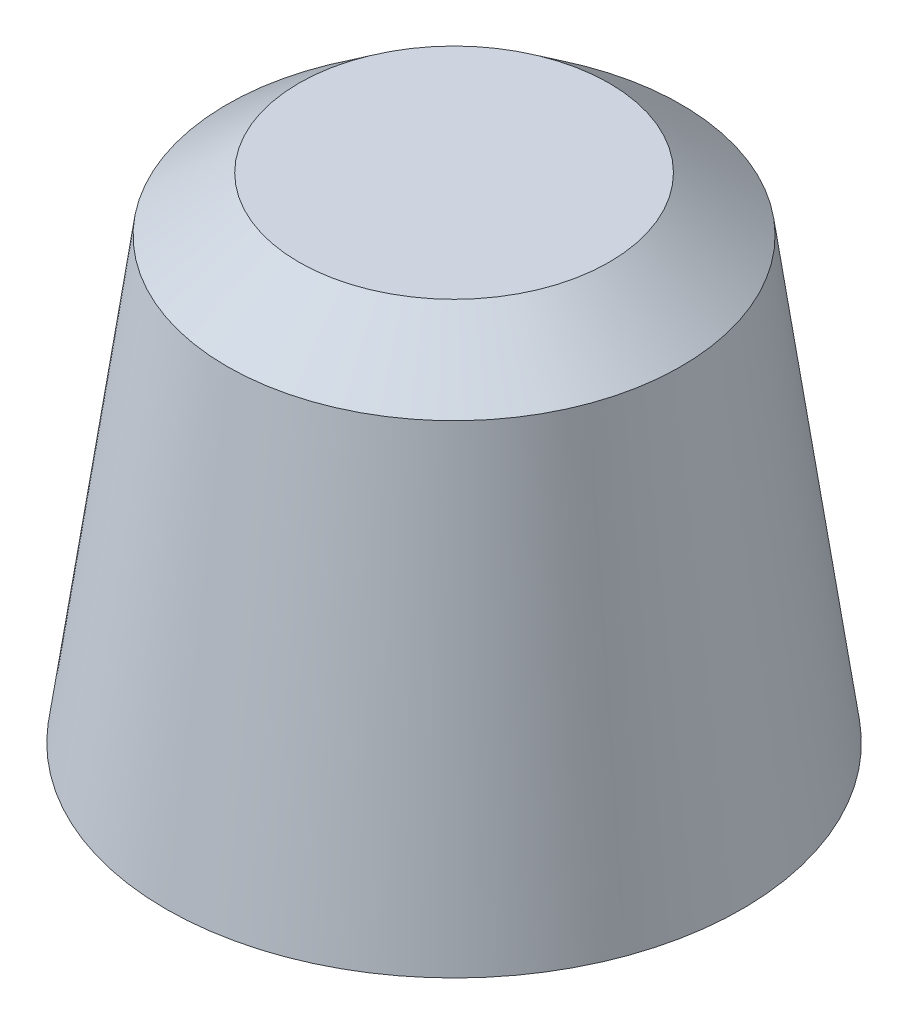
ISO-10303-21;
HEADER;
FILE_DESCRIPTION(('STEP AP214'),'2;1');
FILE_NAME('part.step','',(''),(''),'','','');
FILE_SCHEMA(('AUTOMOTIVE_DESIGN { 1 0 10303 214 1 1 1 1 }'));
ENDSEC;
DATA;
#1=APPLICATION_CONTEXT('core data for automotive mechanical design processes');
#2=APPLICATION_PROTOCOL_DEFINITION('international standard','automotive_design',2000,#1);
#3=PRODUCT_CONTEXT('',#1,'mechanical');
#4=PRODUCT('Part','Part','',(#3));
#5=PRODUCT_RELATED_PRODUCT_CATEGORY('part','',(#4));
#6=PRODUCT_DEFINITION_FORMATION('','',#4);
#7=PRODUCT_DEFINITION_CONTEXT('part definition',#1,'design');
#8=PRODUCT_DEFINITION('design','',#6,#7);
#9=PRODUCT_DEFINITION_SHAPE('','',#8);
#10=(LENGTH_UNIT() NAMED_UNIT(*) SI_UNIT(.MILLI.,.METRE.));
#11=(NAMED_UNIT(*) PLANE_ANGLE_UNIT() SI_UNIT($,.RADIAN.));
#12=(NAMED_UNIT(*) SI_UNIT($,.STERADIAN.) SOLID_ANGLE_UNIT());
#13=UNCERTAINTY_MEASURE_WITH_UNIT(LENGTH_MEASURE(1.E-05),#10,'distance_accuracy_value','');
#14=(GEOMETRIC_REPRESENTATION_CONTEXT(3) GLOBAL_UNCERTAINTY_ASSIGNED_CONTEXT((#13)) GLOBAL_UNIT_ASSIGNED_CONTEXT((#10,
#11,#12)) REPRESENTATION_CONTEXT('',''));
#15=CARTESIAN_POINT('',(0.,0.,0.));
#16=DIRECTION('',(0.,0.,1.));
#17=DIRECTION('',(1.,0.,0.));
#18=AXIS2_PLACEMENT_3D('',#15,#16,#17);
#19=CARTESIAN_POINT('',(0.,9.,0.));
#20=DIRECTION('',(0.,1.,0.));
#21=DIRECTION('',(0.,0.,1.));
#22=AXIS2_PLACEMENT_3D('',#19,#20,#21);
#23=PLANE('',#22);
#24=CARTESIAN_POINT('',(0.,9.,0.));
#25=DIRECTION('',(0.,1.,0.));
#26=DIRECTION('',(0.,0.,1.));
#27=AXIS2_PLACEMENT_3D('',#24,#25,#26);
#28=CIRCLE('',#27,2.82756246158799);
#29=CARTESIAN_POINT('',(0.,9.,2.82756246158799));
#30=VERTEX_POINT('',#29);
#31=EDGE_CURVE('E51',#30,#30,#28,.T.);
#32=ORIENTED_EDGE('',*,*,#31,.T.);
#33=EDGE_LOOP('',(#32));
#34=FACE_BOUND('',#33,.T.);
#35=ADVANCED_FACE('F43',(#34),#23,.T.);
#36=CARTESIAN_POINT('',(0.,0.,0.));
#37=DIRECTION('',(0.,1.,0.));
#38=DIRECTION('',(0.,0.,1.));
#39=AXIS2_PLACEMENT_3D('',#36,#37,#38);
#40=PLANE('',#39);
#41=CARTESIAN_POINT('',(0.,0.,0.));
#42=DIRECTION('',(0.,-1.,0.));
#43=DIRECTION('',(0.,0.,-1.));
#44=AXIS2_PLACEMENT_3D('',#41,#42,#43);
#45=CIRCLE('',#44,2.7);
#46=CARTESIAN_POINT('',(0.,0.,-2.7));
#47=VERTEX_POINT('',#46);
#48=EDGE_CURVE('E64',#47,#47,#45,.T.);
#49=ORIENTED_EDGE('',*,*,#48,.F.);
#50=EDGE_LOOP('',(#49));
#51=FACE_BOUND('',#50,.T.);
#52=CARTESIAN_POINT('',(0.,0.,0.));
#53=DIRECTION('',(0.,1.,0.));
#54=DIRECTION('',(0.,0.,1.));
#55=AXIS2_PLACEMENT_3D('',#52,#53,#54);
#56=CIRCLE('',#55,5.25);
#57=CARTESIAN_POINT('',(0.,0.,5.25));
#58=VERTEX_POINT('',#57);
#59=EDGE_CURVE('E63',#58,#58,#56,.T.);
#60=ORIENTED_EDGE('',*,*,#59,.F.);
#61=EDGE_LOOP('',(#60));
#62=FACE_BOUND('',#61,.T.);
#63=ADVANCED_FACE('F88',(#51,#62),#40,.F.);
#64=CARTESIAN_POINT('',(0.,9.,0.));
#65=DIRECTION('',(0.,-1.,0.));
#66=DIRECTION('',(0.,0.,-1.));
#67=AXIS2_PLACEMENT_3D('',#64,#65,#66);
#68=CONICAL_SURFACE('',#67,4.,0.138006023657519);
#69=CARTESIAN_POINT('',(0.,8.00950772682225,0.));
#70=DIRECTION('',(0.,1.,0.));
#71=DIRECTION('',(0.,0.,1.));
#72=AXIS2_PLACEMENT_3D('',#69,#70,#71);
#73=CIRCLE('',#72,4.13756837127469);
#74=CARTESIAN_POINT('',(0.,8.00950772682225,4.13756837127469));
#75=VERTEX_POINT('',#74);
#76=EDGE_CURVE('E12',#75,#75,#73,.F.);
#77=ORIENTED_EDGE('',*,*,#76,.T.);
#78=EDGE_LOOP('',(#77));
#79=FACE_BOUND('',#78,.T.);
#80=ORIENTED_EDGE('',*,*,#59,.T.);
#81=EDGE_LOOP('',(#80));
#82=FACE_BOUND('',#81,.T.);
#83=ADVANCED_FACE('F79',(#79,#82),#68,.T.);
#84=CARTESIAN_POINT('',(0.,9.,0.));
#85=DIRECTION('',(0.,-1.,0.));
#86=DIRECTION('',(0.,0.,-1.));
#87=AXIS2_PLACEMENT_3D('',#84,#85,#86);
#88=CONICAL_SURFACE('',#87,2.82756246158799,0.923404187054965);
#89=ORIENTED_EDGE('',*,*,#76,.F.);
#90=EDGE_LOOP('',(#89));
#91=FACE_BOUND('',#90,.T.);
#92=ORIENTED_EDGE('',*,*,#31,.F.);
#93=EDGE_LOOP('',(#92));
#94=FACE_BOUND('',#93,.T.);
#95=ADVANCED_FACE('F46',(#91,#94),#88,.T.);
#96=CARTESIAN_POINT('',(0.,7.,0.));
#97=DIRECTION('',(0.,-1.,0.));
#98=DIRECTION('',(0.,0.,-1.));
#99=AXIS2_PLACEMENT_3D('',#96,#97,#98);
#100=CONICAL_SURFACE('',#99,2.7,1.02974425867665);
#101=CARTESIAN_POINT('',(0.,8.62232367137441,0.));
#102=VERTEX_POINT('',#101);
#103=VERTEX_LOOP('',#102);
#104=FACE_BOUND('',#103,.T.);
#105=CARTESIAN_POINT('',(0.,7.,0.));
#106=DIRECTION('',(0.,-1.,0.));
#107=DIRECTION('',(0.,0.,-1.));
#108=AXIS2_PLACEMENT_3D('',#105,#106,#107);
#109=CIRCLE('',#108,2.7);
#110=CARTESIAN_POINT('',(0.,7.,-2.7));
#111=VERTEX_POINT('',#110);
#112=EDGE_CURVE('E61',#111,#111,#109,.T.);
#113=ORIENTED_EDGE('',*,*,#112,.T.);
#114=EDGE_LOOP('',(#113));
#115=FACE_BOUND('',#114,.T.);
#116=ADVANCED_FACE('F54',(#104,#115),#100,.F.);
#117=CARTESIAN_POINT('',(0.,0.,0.));
#118=DIRECTION('',(0.,-1.,0.));
#119=DIRECTION('',(0.,0.,-1.));
#120=AXIS2_PLACEMENT_3D('',#117,#118,#119);
#121=CYLINDRICAL_SURFACE('',#120,2.7);
#122=ORIENTED_EDGE('',*,*,#112,.F.);
#123=EDGE_LOOP('',(#122));
#124=FACE_BOUND('',#123,.T.);
#125=ORIENTED_EDGE('',*,*,#48,.T.);
#126=EDGE_LOOP('',(#125));
#127=FACE_BOUND('',#126,.T.);
#128=ADVANCED_FACE('F57',(#124,#127),#121,.F.);
#129=CLOSED_SHELL('',(#35,#63,#83,#95,#116,#128));
#130=MANIFOLD_SOLID_BREP('B2',#129);
#131=ADVANCED_BREP_SHAPE_REPRESENTATION('',(#18,#130),#14);
#132=SHAPE_DEFINITION_REPRESENTATION(#9,#131);
ENDSEC;
END-ISO-10303-21;
